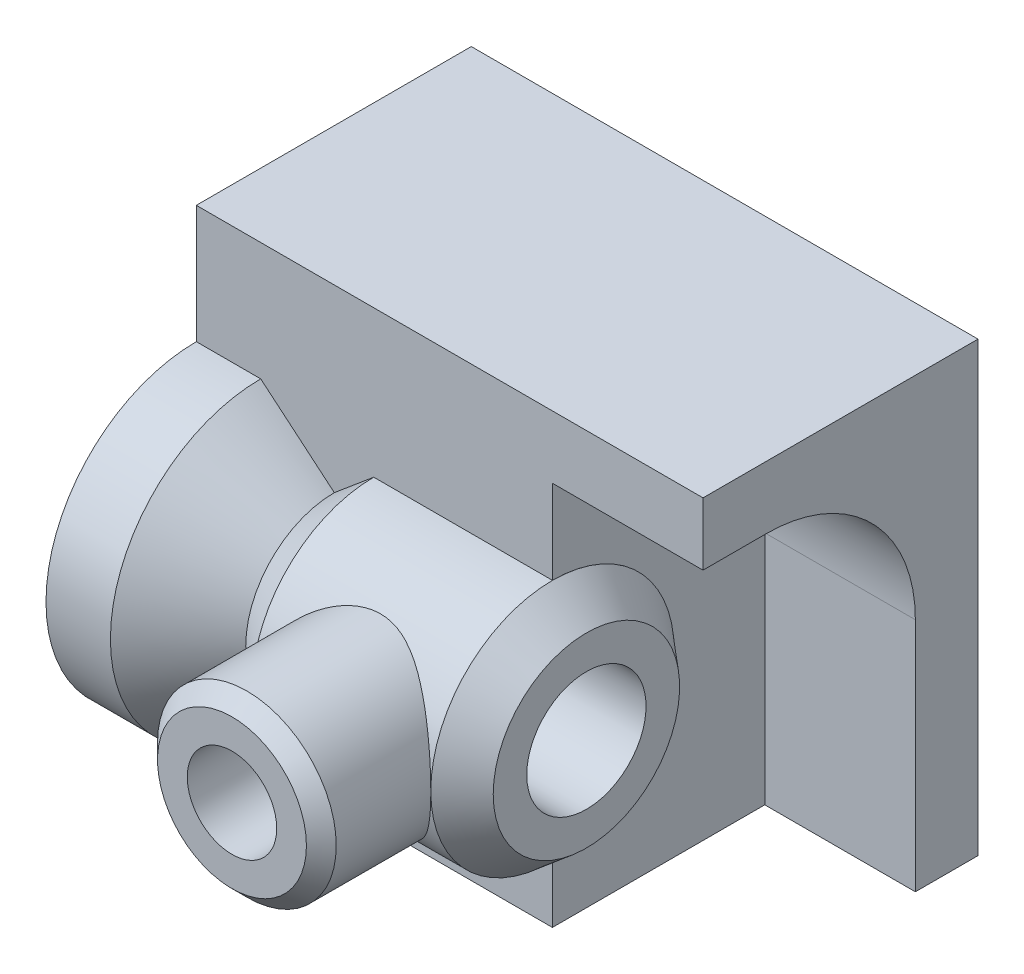
ISO-10303-21;
HEADER;
FILE_DESCRIPTION(('STEP AP214'),'2;1');
FILE_NAME('part.step','',(''),(''),'','','');
FILE_SCHEMA(('AUTOMOTIVE_DESIGN { 1 0 10303 214 1 1 1 1 }'));
ENDSEC;
DATA;
#1=APPLICATION_CONTEXT('core data for automotive mechanical design processes');
#2=APPLICATION_PROTOCOL_DEFINITION('international standard','automotive_design',2000,#1);
#3=PRODUCT_CONTEXT('',#1,'mechanical');
#4=PRODUCT('Part','Part','',(#3));
#5=PRODUCT_RELATED_PRODUCT_CATEGORY('part','',(#4));
#6=PRODUCT_DEFINITION_FORMATION('','',#4);
#7=PRODUCT_DEFINITION_CONTEXT('part definition',#1,'design');
#8=PRODUCT_DEFINITION('design','',#6,#7);
#9=PRODUCT_DEFINITION_SHAPE('','',#8);
#10=(LENGTH_UNIT() NAMED_UNIT(*) SI_UNIT(.MILLI.,.METRE.));
#11=(NAMED_UNIT(*) PLANE_ANGLE_UNIT() SI_UNIT($,.RADIAN.));
#12=(NAMED_UNIT(*) SI_UNIT($,.STERADIAN.) SOLID_ANGLE_UNIT());
#13=UNCERTAINTY_MEASURE_WITH_UNIT(LENGTH_MEASURE(1.E-05),#10,'distance_accuracy_value','');
#14=(GEOMETRIC_REPRESENTATION_CONTEXT(3) GLOBAL_UNCERTAINTY_ASSIGNED_CONTEXT((#13)) GLOBAL_UNIT_ASSIGNED_CONTEXT((#10,
#11,#12)) REPRESENTATION_CONTEXT('',''));
#15=CARTESIAN_POINT('',(0.,0.,0.));
#16=DIRECTION('',(0.,0.,1.));
#17=DIRECTION('',(1.,0.,0.));
#18=AXIS2_PLACEMENT_3D('',#15,#16,#17);
#19=CARTESIAN_POINT('',(11.94,0.,0.));
#20=DIRECTION('',(-1.,0.,0.));
#21=DIRECTION('',(0.,0.,1.));
#22=AXIS2_PLACEMENT_3D('',#19,#20,#21);
#23=PLANE('',#22);
#24=DIRECTION('',(0.,-1.,0.));
#25=VECTOR('',#24,1.);
#26=CARTESIAN_POINT('',(11.94,6.9,-7.12));
#27=LINE('',#26,#25);
#28=CARTESIAN_POINT('',(11.94,1.9,-7.12));
#29=VERTEX_POINT('',#28);
#30=CARTESIAN_POINT('',(11.94,-6.,-7.12));
#31=VERTEX_POINT('',#30);
#32=EDGE_CURVE('E166',#29,#31,#27,.T.);
#33=ORIENTED_EDGE('',*,*,#32,.F.);
#34=CARTESIAN_POINT('',(11.94,1.9,-2.12));
#35=DIRECTION('',(-1.,0.,0.));
#36=DIRECTION('',(0.,0.,1.));
#37=AXIS2_PLACEMENT_3D('',#34,#35,#36);
#38=CIRCLE('',#37,5.);
#39=CARTESIAN_POINT('',(11.94,6.9,-2.12));
#40=VERTEX_POINT('',#39);
#41=EDGE_CURVE('E70',#29,#40,#38,.F.);
#42=ORIENTED_EDGE('',*,*,#41,.T.);
#43=DIRECTION('',(0.,0.,-1.));
#44=VECTOR('',#43,1.);
#45=CARTESIAN_POINT('',(11.94,6.9,0.));
#46=LINE('',#45,#44);
#47=CARTESIAN_POINT('',(11.94,6.9,0.));
#48=VERTEX_POINT('',#47);
#49=EDGE_CURVE('E334',#48,#40,#46,.T.);
#50=ORIENTED_EDGE('',*,*,#49,.F.);
#51=DIRECTION('',(0.,1.,0.));
#52=VECTOR('',#51,1.);
#53=CARTESIAN_POINT('',(11.94,9.,0.));
#54=LINE('',#53,#52);
#55=CARTESIAN_POINT('',(11.94,4.08,0.));
#56=VERTEX_POINT('',#55);
#57=EDGE_CURVE('E171',#56,#48,#54,.T.);
#58=ORIENTED_EDGE('',*,*,#57,.F.);
#59=CARTESIAN_POINT('',(11.94,0.,0.));
#60=DIRECTION('',(-1.,0.,0.));
#61=DIRECTION('',(0.,0.,1.));
#62=AXIS2_PLACEMENT_3D('',#59,#60,#61);
#63=CIRCLE('',#62,4.08);
#64=CARTESIAN_POINT('',(11.94,-4.08,0.));
#65=VERTEX_POINT('',#64);
#66=EDGE_CURVE('E247',#56,#65,#63,.T.);
#67=ORIENTED_EDGE('',*,*,#66,.T.);
#68=CARTESIAN_POINT('',(11.94,-6.,0.));
#69=VERTEX_POINT('',#68);
#70=EDGE_CURVE('E189',#69,#65,#54,.T.);
#71=ORIENTED_EDGE('',*,*,#70,.F.);
#72=DIRECTION('',(0.,0.,1.));
#73=VECTOR('',#72,1.);
#74=CARTESIAN_POINT('',(11.94,-6.,-9.22));
#75=LINE('',#74,#73);
#76=EDGE_CURVE('E185',#31,#69,#75,.T.);
#77=ORIENTED_EDGE('',*,*,#76,.F.);
#78=EDGE_LOOP('',(#33,#42,#50,#58,#67,#71,#77));
#79=FACE_BOUND('',#78,.T.);
#80=ADVANCED_FACE('F39',(#79),#23,.F.);
#81=CARTESIAN_POINT('',(-0.16368545140619,0.,0.));
#82=DIRECTION('',(-1.,0.,0.));
#83=DIRECTION('',(0.,0.,1.));
#84=AXIS2_PLACEMENT_3D('',#81,#82,#83);
#85=CYLINDRICAL_SURFACE('',#84,2.);
#86=CARTESIAN_POINT('',(13.08,0.,0.));
#87=DIRECTION('',(-1.,0.,0.));
#88=DIRECTION('',(0.,0.,1.));
#89=AXIS2_PLACEMENT_3D('',#86,#87,#88);
#90=CIRCLE('',#89,2.);
#91=CARTESIAN_POINT('',(13.08,0.,2.));
#92=VERTEX_POINT('',#91);
#93=EDGE_CURVE('E376',#92,#92,#90,.T.);
#94=ORIENTED_EDGE('',*,*,#93,.F.);
#95=EDGE_LOOP('',(#94));
#96=FACE_BOUND('',#95,.T.);
#97=CARTESIAN_POINT('',(3.,0.,0.));
#98=DIRECTION('',(-1.,0.,0.));
#99=DIRECTION('',(0.,0.,1.));
#100=AXIS2_PLACEMENT_3D('',#97,#98,#99);
#101=CIRCLE('',#100,2.);
#102=CARTESIAN_POINT('',(3.,0.,2.));
#103=VERTEX_POINT('',#102);
#104=EDGE_CURVE('E380',#103,#103,#101,.T.);
#105=ORIENTED_EDGE('',*,*,#104,.T.);
#106=EDGE_LOOP('',(#105));
#107=FACE_BOUND('',#106,.T.);
#108=CARTESIAN_POINT('',(10.4458258717611,0.,2.));
#109=CARTESIAN_POINT('',(10.445821079749,-0.0732207358411543,1.99999540196395));
#110=CARTESIAN_POINT('',(10.4404208473866,-0.146561062021485,1.99593645526274));
#111=CARTESIAN_POINT('',(10.4191588083509,-0.290936396286467,1.98006607281083));
#112=CARTESIAN_POINT('',(10.403270700111,-0.361965136229004,1.96823514679854));
#113=CARTESIAN_POINT('',(10.3621129624773,-0.499234626631249,1.9379567495606));
#114=CARTESIAN_POINT('',(10.3369003581919,-0.565501615403737,1.91954951932009));
#115=CARTESIAN_POINT('',(10.2782835275738,-0.692422335520753,1.87750556721694));
#116=CARTESIAN_POINT('',(10.2448816975675,-0.753077701796332,1.85387037535483));
#117=CARTESIAN_POINT('',(10.1675628601702,-0.873465937590145,1.80049544543983));
#118=CARTESIAN_POINT('',(10.122958542427,-0.932593229272032,1.7703930854844));
#119=CARTESIAN_POINT('',(10.0263300343999,-1.04302716767671,1.70767017883378));
#120=CARTESIAN_POINT('',(9.97429438896122,-1.09432148272226,1.67504578078609));
#121=CARTESIAN_POINT('',(9.85224291848269,-1.19837161436623,1.6027112365199));
#122=CARTESIAN_POINT('',(9.78072219463935,-1.24930578421204,1.56290854864639));
#123=CARTESIAN_POINT('',(9.62837485939451,-1.33861998176348,1.48711444664135));
#124=CARTESIAN_POINT('',(9.54756117476075,-1.37701716983077,1.45111786883675));
#125=CARTESIAN_POINT('',(9.40632303308482,-1.42880627811788,1.39977155180178));
#126=CARTESIAN_POINT('',(9.34843517463268,-1.44625674456539,1.38157751186733));
#127=CARTESIAN_POINT('',(9.22943313697614,-1.47420672564844,1.35171594150685));
#128=CARTESIAN_POINT('',(9.16832669388627,-1.48472215355267,1.34003347910832));
#129=CARTESIAN_POINT('',(9.04364328623029,-1.49812822141445,1.32503759684553));
#130=CARTESIAN_POINT('',(8.980049065037,-1.50094954854207,1.32180026676597));
#131=CARTESIAN_POINT('',(8.85321096087948,-1.49848213241869,1.32459531776068));
#132=CARTESIAN_POINT('',(8.78996721167362,-1.49319048157349,1.33063102218113));
#133=CARTESIAN_POINT('',(8.67263452433527,-1.47597739291882,1.34967623262519));
#134=CARTESIAN_POINT('',(8.61828950071487,-1.46482486380817,1.36187157059871));
#135=CARTESIAN_POINT('',(8.51238699304018,-1.43705671120733,1.39114192844939));
#136=CARTESIAN_POINT('',(8.46083224393746,-1.42043583681172,1.40822163640769));
#137=CARTESIAN_POINT('',(8.32956948512691,-1.37033064172535,1.45741769294306));
#138=CARTESIAN_POINT('',(8.25242545511755,-1.3328014849398,1.49225649139232));
#139=CARTESIAN_POINT('',(8.10662934789198,-1.2461802331452,1.56533298145196));
#140=CARTESIAN_POINT('',(8.0379985325064,-1.19706004255879,1.60357878886109));
#141=CARTESIAN_POINT('',(7.90807248135741,-1.08651604102136,1.68051672313145));
#142=CARTESIAN_POINT('',(7.84700526487958,-1.02481375526037,1.71919586730239));
#143=CARTESIAN_POINT('',(7.7355622249799,-0.890422521709595,1.79248037980972));
#144=CARTESIAN_POINT('',(7.68516595153068,-0.817755054293762,1.8270934826376));
#145=CARTESIAN_POINT('',(7.60584507252073,-0.677902080454148,1.88279726073643));
#146=CARTESIAN_POINT('',(7.57464127754528,-0.612539870185625,1.90520770945008));
#147=CARTESIAN_POINT('',(7.52160099129719,-0.476352173202092,1.94372904416947));
#148=CARTESIAN_POINT('',(7.49975863326178,-0.405530141063772,1.95984387504351));
#149=CARTESIAN_POINT('',(7.46657250887462,-0.259676232483524,1.98445588635989));
#150=CARTESIAN_POINT('',(7.45529369282243,-0.184621281405948,1.99290592971749));
#151=CARTESIAN_POINT('',(7.44427627438935,-0.0332012397969222,2.00115883659445));
#152=CARTESIAN_POINT('',(7.44453280306569,0.0431632843727187,2.00096534845408));
#153=CARTESIAN_POINT('',(7.45593674103424,0.186804217329621,1.99242547175873));
#154=CARTESIAN_POINT('',(7.46598640864973,0.254222327546129,1.98490086600401));
#155=CARTESIAN_POINT('',(7.49479965176892,0.386110670609114,1.96351320201588));
#156=CARTESIAN_POINT('',(7.51356508145047,0.450580272987257,1.94964879507262));
#157=CARTESIAN_POINT('',(7.55971340235416,0.577416779689766,1.91599830683313));
#158=CARTESIAN_POINT('',(7.58737705318845,0.639629172536135,1.89602050290194));
#159=CARTESIAN_POINT('',(7.64999832718664,0.75851852704307,1.85166985411963));
#160=CARTESIAN_POINT('',(7.68495695940079,0.8151947213364,1.82729640132068));
#161=CARTESIAN_POINT('',(7.76760911817162,0.931511626319034,1.77119146886499));
#162=CARTESIAN_POINT('',(7.81645441119851,0.990066762698699,1.73891095025037));
#163=CARTESIAN_POINT('',(7.92183462434944,1.09871974855854,1.67238952874785));
#164=CARTESIAN_POINT('',(7.97838657145441,1.14879830469576,1.63814438507395));
#165=CARTESIAN_POINT('',(8.10997575272223,1.24877541075626,1.56369128291497));
#166=CARTESIAN_POINT('',(8.18648343325335,1.29683043648705,1.52358718520101));
#167=CARTESIAN_POINT('',(8.3491859497335,1.37923235998282,1.44940591348451));
#168=CARTESIAN_POINT('',(8.43535099366962,1.41362000515519,1.41531099570969));
#169=CARTESIAN_POINT('',(8.58124032063553,1.45615734256767,1.37118877808583));
#170=CARTESIAN_POINT('',(8.63821699816343,1.46931009512996,1.35695811824565));
#171=CARTESIAN_POINT('',(8.75453291874423,1.48891522181906,1.33542056103011));
#172=CARTESIAN_POINT('',(8.8138665785633,1.4953825519924,1.32809821220233));
#173=CARTESIAN_POINT('',(8.93365495157238,1.50115320209064,1.32157601792209));
#174=CARTESIAN_POINT('',(8.99411381477062,1.50042015325262,1.32241740684975));
#175=CARTESIAN_POINT('',(9.11388271051321,1.49176883838219,1.33216448543666));
#176=CARTESIAN_POINT('',(9.17319115965831,1.48384130024585,1.34108058157484));
#177=CARTESIAN_POINT('',(9.30174044317185,1.45893841819723,1.36817348797772));
#178=CARTESIAN_POINT('',(9.37032305189382,1.44036567954112,1.38794705950643));
#179=CARTESIAN_POINT('',(9.50236072059153,1.39469627266119,1.43382963385409));
#180=CARTESIAN_POINT('',(9.56580231379924,1.3675780729773,1.45995460146929));
#181=CARTESIAN_POINT('',(9.70834650224738,1.29498918933643,1.52516477328823));
#182=CARTESIAN_POINT('',(9.7852474545168,1.24641542065971,1.56560203191104));
#183=CARTESIAN_POINT('',(9.92895191673861,1.13650718465937,1.64713510181272));
#184=CARTESIAN_POINT('',(9.99574633770589,1.07516134758578,1.68823146954222));
#185=CARTESIAN_POINT('',(10.1186577140444,0.939627144937903,1.76728988939793));
#186=CARTESIAN_POINT('',(10.1746821911382,0.865337161562872,1.80522333711071));
#187=CARTESIAN_POINT('',(10.2730489229064,0.705159098936217,1.87357289668096));
#188=CARTESIAN_POINT('',(10.3154238463336,0.619299420401809,1.90400691592958));
#189=CARTESIAN_POINT('',(10.3736252927468,0.46484029035647,1.94636704624047));
#190=CARTESIAN_POINT('',(10.3935926031372,0.398553614774747,1.96110322499718));
#191=CARTESIAN_POINT('',(10.4242437743725,0.262841610392775,1.98383739970237));
#192=CARTESIAN_POINT('',(10.434953562011,0.193425623834921,1.99185421210894));
#193=CARTESIAN_POINT('',(10.4424305659754,0.102963309861902,1.99745471706309));
#194=CARTESIAN_POINT('',(10.4437021492505,0.0824069459941339,1.9984076143208));
#195=CARTESIAN_POINT('',(10.445400544992,0.0412368896243834,1.99968095423138));
#196=CARTESIAN_POINT('',(10.4458272214684,0.0206231884283906,2.00000129507253));
#197=CARTESIAN_POINT('',(10.4458258717611,0.,2.));
#198=B_SPLINE_CURVE_WITH_KNOTS('',3,(#108,#109,#110,#111,#112,#113,#114,#115,#116,#117,#118,
#119,#120,#121,#122,#123,#124,#125,#126,#127,#128,#129,#130,#131,#132,#133,#134,#135,#136,#137,
#138,#139,#140,#141,#142,#143,#144,#145,#146,#147,#148,#149,#150,#151,#152,#153,#154,#155,#156,
#157,#158,#159,#160,#161,#162,#163,#164,#165,#166,#167,#168,#169,#170,#171,#172,#173,#174,#175,
#176,#177,#178,#179,#180,#181,#182,#183,#184,#185,#186,#187,#188,#189,#190,#191,#192,#193,#194,
#195,#196,#197),.UNSPECIFIED.,.T.,.F.,(4,2,2,2,2,2,2,2,2,2,2,2,2,2,2,2,2,2,2,2,2,2,2,2,2,2,2,2,
2,2,2,2,2,2,2,2,2,2,2,2,2,2,2,2,4),(0.,0.219571786572042,0.439696319423244,0.658496333573381,
0.877232398849293,1.1162243131743,1.35558868405162,1.64360015887451,1.93121574056507,
2.11999518529901,2.3083399319529,2.49837587621257,2.6884799430021,2.85826890162709,
3.02822137600639,3.30449331805909,3.58144192357888,3.8653588393809,4.1487266249369,
4.37526505006389,4.60166129643117,4.82944058166898,5.05712372466613,5.26191187011994,
5.46674360185812,5.67880439483679,5.89089453977541,6.13840382081867,6.38646908985451,
6.68168596015946,6.97601595850112,7.15589161422932,7.33536399114208,7.5157433385474,
7.69635548563854,7.91639670960133,8.1369968513992,8.43412246655767,8.73151372390892,
9.03135449492648,9.33047220273162,9.54195697541629,9.75284752283255,9.8146816687871,
9.87652576630966),.UNSPECIFIED.);
#199=CARTESIAN_POINT('',(10.4458258717611,0.,2.));
#200=VERTEX_POINT('',#199);
#201=EDGE_CURVE('E44',#200,#200,#198,.T.);
#202=ORIENTED_EDGE('',*,*,#201,.F.);
#203=EDGE_LOOP('',(#202));
#204=FACE_BOUND('',#203,.T.);
#205=ADVANCED_FACE('F292',(#96,#107,#204),#85,.F.);
#206=CARTESIAN_POINT('',(-0.16368545140619,0.,0.));
#207=DIRECTION('',(-1.,0.,0.));
#208=DIRECTION('',(0.,0.,1.));
#209=AXIS2_PLACEMENT_3D('',#206,#207,#208);
#210=CYLINDRICAL_SURFACE('',#209,4.08);
#211=ORIENTED_EDGE('',*,*,#66,.F.);
#212=DIRECTION('',(-1.,0.,0.));
#213=VECTOR('',#212,1.);
#214=CARTESIAN_POINT('',(-0.16368545140619,4.08,0.));
#215=LINE('',#214,#213);
#216=CARTESIAN_POINT('',(5.94977642444958,4.08,0.));
#217=VERTEX_POINT('',#216);
#218=EDGE_CURVE('E243',#56,#217,#215,.T.);
#219=ORIENTED_EDGE('',*,*,#218,.T.);
#220=CARTESIAN_POINT('',(5.94977642444958,0.,0.));
#221=DIRECTION('',(-1.,0.,0.));
#222=DIRECTION('',(0.,0.,1.));
#223=AXIS2_PLACEMENT_3D('',#220,#221,#222);
#224=CIRCLE('',#223,4.08);
#225=CARTESIAN_POINT('',(5.94977642444958,0.,4.08));
#226=VERTEX_POINT('',#225);
#227=EDGE_CURVE('E360',#226,#217,#224,.T.);
#228=ORIENTED_EDGE('',*,*,#227,.F.);
#229=CARTESIAN_POINT('',(11.9418753190725,0.,4.08));
#230=CARTESIAN_POINT('',(11.9418746255293,0.0735491775092905,4.07999934370344));
#231=CARTESIAN_POINT('',(11.9391601986366,0.147117172830394,4.07800462354872));
#232=CARTESIAN_POINT('',(11.9283569013117,0.293657624512855,4.07008212111903));
#233=CARTESIAN_POINT('',(11.9202648620603,0.366629704044253,4.06415201987885));
#234=CARTESIAN_POINT('',(11.8880424889429,0.584028441169121,4.04060521606749));
#235=CARTESIAN_POINT('',(11.8559662829877,0.726763776326168,4.01723244972463));
#236=CARTESIAN_POINT('',(11.7728274093527,1.00252836167417,3.95742418455096));
#237=CARTESIAN_POINT('',(11.7218779859657,1.13560995371552,3.92106664355969));
#238=CARTESIAN_POINT('',(11.6033551784396,1.39054168583626,3.83806719325733));
#239=CARTESIAN_POINT('',(11.5357866194837,1.51239507181096,3.79142826943968));
#240=CARTESIAN_POINT('',(11.3793726788491,1.75406839076773,3.68626868372276));
#241=CARTESIAN_POINT('',(11.2891463915808,1.87268268398932,3.62705139921293));
#242=CARTESIAN_POINT('',(11.0935356154691,2.09416700324028,3.50384641045455));
#243=CARTESIAN_POINT('',(10.9881274198505,2.19701187666411,3.43985132230204));
#244=CARTESIAN_POINT('',(10.8088174116083,2.34803279003245,3.33733618298643));
#245=CARTESIAN_POINT('',(10.7392942779565,2.40156036825658,3.29892183982521));
#246=CARTESIAN_POINT('',(10.5954922823558,2.50252688642086,3.22300488522619));
#247=CARTESIAN_POINT('',(10.5212120512668,2.54996406157149,3.18550254059446));
#248=CARTESIAN_POINT('',(10.2915161009608,2.6826572457679,3.07616199464393));
#249=CARTESIAN_POINT('',(10.1289147879502,2.75857482115139,3.00729085433035));
#250=CARTESIAN_POINT('',(9.8436306534068,2.86093043407332,2.90942319761777));
#251=CARTESIAN_POINT('',(9.72575270023775,2.89542560324355,2.87479141123914));
#252=CARTESIAN_POINT('',(9.48374420314903,2.94996006160554,2.81880730976438));
#253=CARTESIAN_POINT('',(9.35962842622481,2.97003191668609,2.79742509406978));
#254=CARTESIAN_POINT('',(9.10703702268412,2.9944134743516,2.77132627519933));
#255=CARTESIAN_POINT('',(8.97853503062432,2.99859960795079,2.76674033340974));
#256=CARTESIAN_POINT('',(8.72263922491761,2.99047106473708,2.77551845305346));
#257=CARTESIAN_POINT('',(8.59524621548486,2.97814527830562,2.78889459982831));
#258=CARTESIAN_POINT('',(8.33226505766346,2.93589507444192,2.83335840833875));
#259=CARTESIAN_POINT('',(8.19726913149407,2.90422045450408,2.86619626341038));
#260=CARTESIAN_POINT('',(7.93633935176526,2.82417665422082,2.94509158471911));
#261=CARTESIAN_POINT('',(7.81042779130526,2.77576798724677,2.99118027471352));
#262=CARTESIAN_POINT('',(7.52615201203146,2.6444780153083,3.10859023968818));
#263=CARTESIAN_POINT('',(7.37194900325097,2.55546048813702,3.18308491453239));
#264=CARTESIAN_POINT('',(7.08259623635488,2.35285369217717,3.3356612883369));
#265=CARTESIAN_POINT('',(6.94746863928307,2.23923622601981,3.4137470219284));
#266=CARTESIAN_POINT('',(6.69613091725255,1.98679116840513,3.56667542334824));
#267=CARTESIAN_POINT('',(6.58021887638197,1.8476263713472,3.64145576393111));
#268=CARTESIAN_POINT('',(6.37346213794538,1.54673585558053,3.77904999058308));
#269=CARTESIAN_POINT('',(6.28256010526396,1.38506304066749,3.84189114289819));
#270=CARTESIAN_POINT('',(6.15018881204529,1.0863569046016,3.93498247158788));
#271=CARTESIAN_POINT('',(6.10202259060305,0.953601800294148,3.96945751059044));
#272=CARTESIAN_POINT('',(6.02452718219414,0.680059272086245,4.02533777035719));
#273=CARTESIAN_POINT('',(5.99518405390116,0.53927787720744,4.04675266353923));
#274=CARTESIAN_POINT('',(5.95696410457922,0.252900496827857,4.07470371198482));
#275=CARTESIAN_POINT('',(5.94816794624341,0.107287804327193,4.08118122525242));
#276=CARTESIAN_POINT('',(5.9518698839197,-0.183523466462492,4.07846264711362));
#277=CARTESIAN_POINT('',(5.96436805269668,-0.32872204333474,4.06926650214874));
#278=CARTESIAN_POINT('',(6.00842036698704,-0.605291212919964,4.03710704385833));
#279=CARTESIAN_POINT('',(6.03875944078061,-0.736963854433493,4.01502219692625));
#280=CARTESIAN_POINT('',(6.11590286405932,-0.992834211823623,3.95952472796475));
#281=CARTESIAN_POINT('',(6.16271066433868,-1.11703035471103,3.9261097319123));
#282=CARTESIAN_POINT('',(6.27518181968447,-1.36528066081615,3.84716698523618));
#283=CARTESIAN_POINT('',(6.34204216901356,-1.48854930475332,3.8008911485081));
#284=CARTESIAN_POINT('',(6.49049587008036,-1.72246575614312,3.70077415414543));
#285=CARTESIAN_POINT('',(6.57209820922258,-1.83310579709264,3.64692838599407));
#286=CARTESIAN_POINT('',(6.76440773410127,-2.06003234814774,3.52451065146939));
#287=CARTESIAN_POINT('',(6.87770815776099,-2.17363940754857,3.45504810994084));
#288=CARTESIAN_POINT('',(7.12070849729213,-2.38135452932775,3.31530123309393));
#289=CARTESIAN_POINT('',(7.250423757459,-2.47544412708751,3.24501618543326));
#290=CARTESIAN_POINT('',(7.51194003933156,-2.63464908888821,3.11679635521239));
#291=CARTESIAN_POINT('',(7.6422958895957,-2.70169836510446,3.05832600632089));
#292=CARTESIAN_POINT('',(7.91518029363006,-2.81707631511567,2.95239158775341));
#293=CARTESIAN_POINT('',(8.0576828159428,-2.8654438526854,2.90490475250362));
#294=CARTESIAN_POINT('',(8.31877476998334,-2.9320296296191,2.83748505928712));
#295=CARTESIAN_POINT('',(8.43522624206179,-2.9546420356318,2.81371356054709));
#296=CARTESIAN_POINT('',(8.67193772353184,-2.98588220326539,2.78054882930827));
#297=CARTESIAN_POINT('',(8.79219150776876,-2.99453172737004,2.77113322305526));
#298=CARTESIAN_POINT('',(9.03335716969437,-2.99720254662996,2.76824584055418));
#299=CARTESIAN_POINT('',(9.15426993551904,-2.99118842844831,2.77481266249973));
#300=CARTESIAN_POINT('',(9.3928272307319,-2.96495466781955,2.80281760012797));
#301=CARTESIAN_POINT('',(9.51046706258697,-2.94471560226142,2.82427604871654));
#302=CARTESIAN_POINT('',(9.77240239302873,-2.88373916560956,2.88666237959238));
#303=CARTESIAN_POINT('',(9.91479458174369,-2.83881601029515,2.93138613248897));
#304=CARTESIAN_POINT('',(10.1879343818935,-2.73041977179836,3.03260688843912));
#305=CARTESIAN_POINT('',(10.3186502086816,-2.66689795523717,3.0891347082059));
#306=CARTESIAN_POINT('',(10.6021338310732,-2.50332271355381,3.22395215696351));
#307=CARTESIAN_POINT('',(10.7510655473563,-2.3980264601012,3.30394855934907));
#308=CARTESIAN_POINT('',(11.027779632599,-2.16212445847226,3.46292838403462));
#309=CARTESIAN_POINT('',(11.1555736796325,-2.03153277260952,3.54191234328373));
#310=CARTESIAN_POINT('',(11.3692176247795,-1.76847995650271,3.67931491263199));
#311=CARTESIAN_POINT('',(11.4585007654574,-1.63948753817898,3.73901965928155));
#312=CARTESIAN_POINT('',(11.6172297524853,-1.36560423865754,3.84748306497215));
#313=CARTESIAN_POINT('',(11.6866962929687,-1.22073016295094,3.89625313143086));
#314=CARTESIAN_POINT('',(11.7936669694421,-0.940783829850461,3.97229217643159));
#315=CARTESIAN_POINT('',(11.8344120253634,-0.807530152479541,4.00169489006318));
#316=CARTESIAN_POINT('',(11.8970887683045,-0.534637030024803,4.04716762757649));
#317=CARTESIAN_POINT('',(11.9190684233969,-0.395014833485447,4.06327164208493));
#318=CARTESIAN_POINT('',(11.9346648659253,-0.212052449793226,4.07470797167595));
#319=CARTESIAN_POINT('',(11.9373658521055,-0.169720568147044,4.07668967302653));
#320=CARTESIAN_POINT('',(11.9409713953748,-0.0849278928753425,4.07933596205495));
#321=CARTESIAN_POINT('',(11.9418757195224,-0.0424670832486664,4.08000037894374));
#322=CARTESIAN_POINT('',(11.9418753190725,0.,4.08));
#323=B_SPLINE_CURVE_WITH_KNOTS('',3,(#229,#230,#231,#232,#233,#234,#235,#236,#237,#238,#239,
#240,#241,#242,#243,#244,#245,#246,#247,#248,#249,#250,#251,#252,#253,#254,#255,#256,#257,#258,
#259,#260,#261,#262,#263,#264,#265,#266,#267,#268,#269,#270,#271,#272,#273,#274,#275,#276,#277,
#278,#279,#280,#281,#282,#283,#284,#285,#286,#287,#288,#289,#290,#291,#292,#293,#294,#295,#296,
#297,#298,#299,#300,#301,#302,#303,#304,#305,#306,#307,#308,#309,#310,#311,#312,#313,#314,#315,
#316,#317,#318,#319,#320,#321,#322),.UNSPECIFIED.,.T.,.F.,(4,2,2,2,2,2,2,2,2,2,2,2,2,2,2,2,2,2,
2,2,2,2,2,2,2,2,2,2,2,2,2,2,2,2,2,2,2,2,2,2,2,2,2,2,2,2,4),(0.,0.220595577062654,
0.441321257976244,0.883286509730171,1.32264171086547,1.76186950031609,2.24127565253485,
2.72143868813517,3.00848730325254,3.29561890836615,3.86846769204417,4.24999755340358,
4.63066324192637,5.01428398566845,5.3981629683893,5.82332921804758,6.24950564133932,
6.82557169372779,7.40230158362532,7.98727698935941,8.5708999556244,9.0052104757723,
9.43919895124136,9.87488832330769,10.3105791841719,10.7195627009969,11.1286319657571,
11.5700010323466,12.0116400917606,12.5341944670786,13.0572409760271,13.529124426928,
14.0000208585275,14.3614939244186,14.7224030541882,15.0841846582344,15.4464612103355,
15.9114903100019,16.3777489825524,16.9723688736843,17.5666591457632,18.0682540916264,
18.5693232968338,18.994799266484,19.4191843510437,19.5465390910889,19.6739103418989),.UNSPECIFIED.);
#324=CARTESIAN_POINT('',(11.9418753190725,0.,4.08));
#325=VERTEX_POINT('',#324);
#326=EDGE_CURVE('E259',#325,#226,#323,.T.);
#327=ORIENTED_EDGE('',*,*,#326,.F.);
#328=CARTESIAN_POINT('',(11.9418753190725,0.,0.));
#329=DIRECTION('',(-1.,0.,0.));
#330=DIRECTION('',(0.,0.,1.));
#331=AXIS2_PLACEMENT_3D('',#328,#329,#330);
#332=CIRCLE('',#331,4.08);
#333=EDGE_CURVE('E365',#325,#325,#332,.T.);
#334=ORIENTED_EDGE('',*,*,#333,.T.);
#335=EDGE_CURVE('E250',#226,#325,#323,.T.);
#336=ORIENTED_EDGE('',*,*,#335,.F.);
#337=CARTESIAN_POINT('',(5.94977642444958,-4.08,0.));
#338=VERTEX_POINT('',#337);
#339=EDGE_CURVE('E355',#338,#226,#224,.T.);
#340=ORIENTED_EDGE('',*,*,#339,.F.);
#341=DIRECTION('',(-1.,0.,0.));
#342=VECTOR('',#341,1.);
#343=CARTESIAN_POINT('',(-0.16368545140619,-4.08,0.));
#344=LINE('',#343,#342);
#345=EDGE_CURVE('E227',#338,#65,#344,.F.);
#346=ORIENTED_EDGE('',*,*,#345,.T.);
#347=EDGE_LOOP('',(#211,#219,#228,#327,#334,#336,#340,#346));
#348=FACE_BOUND('',#347,.T.);
#349=ADVANCED_FACE('F262',(#348),#210,.T.);
#350=CARTESIAN_POINT('',(0.,5.04,0.));
#351=DIRECTION('',(1.,0.,0.));
#352=DIRECTION('',(0.,0.,-1.));
#353=AXIS2_PLACEMENT_3D('',#350,#351,#352);
#354=PLANE('',#353);
#355=CARTESIAN_POINT('',(0.,0.,0.));
#356=DIRECTION('',(-1.,0.,0.));
#357=DIRECTION('',(0.,0.,1.));
#358=AXIS2_PLACEMENT_3D('',#355,#356,#357);
#359=CIRCLE('',#358,3.65);
#360=CARTESIAN_POINT('',(0.,0.,3.65));
#361=VERTEX_POINT('',#360);
#362=EDGE_CURVE('E388',#361,#361,#359,.T.);
#363=ORIENTED_EDGE('',*,*,#362,.F.);
#364=EDGE_LOOP('',(#363));
#365=FACE_BOUND('',#364,.T.);
#366=CARTESIAN_POINT('',(0.,0.,0.));
#367=DIRECTION('',(-1.,0.,0.));
#368=DIRECTION('',(0.,0.,1.));
#369=AXIS2_PLACEMENT_3D('',#366,#367,#368);
#370=CIRCLE('',#369,5.04);
#371=CARTESIAN_POINT('',(0.,-5.04,0.));
#372=VERTEX_POINT('',#371);
#373=CARTESIAN_POINT('',(0.,5.04,0.));
#374=VERTEX_POINT('',#373);
#375=EDGE_CURVE('E260',#372,#374,#370,.T.);
#376=ORIENTED_EDGE('',*,*,#375,.T.);
#377=DIRECTION('',(0.,1.,0.));
#378=VECTOR('',#377,1.);
#379=CARTESIAN_POINT('',(0.,9.,0.));
#380=LINE('',#379,#378);
#381=CARTESIAN_POINT('',(0.,9.,0.));
#382=VERTEX_POINT('',#381);
#383=EDGE_CURVE('E197',#374,#382,#380,.T.);
#384=ORIENTED_EDGE('',*,*,#383,.T.);
#385=DIRECTION('',(0.,0.,-1.));
#386=VECTOR('',#385,1.);
#387=CARTESIAN_POINT('',(0.,9.,-9.22));
#388=LINE('',#387,#386);
#389=CARTESIAN_POINT('',(0.,9.,-9.22));
#390=VERTEX_POINT('',#389);
#391=EDGE_CURVE('E188',#382,#390,#388,.T.);
#392=ORIENTED_EDGE('',*,*,#391,.T.);
#393=DIRECTION('',(0.,-1.,0.));
#394=VECTOR('',#393,1.);
#395=CARTESIAN_POINT('',(0.,9.,-9.22));
#396=LINE('',#395,#394);
#397=CARTESIAN_POINT('',(0.,-6.,-9.22));
#398=VERTEX_POINT('',#397);
#399=EDGE_CURVE('E173',#390,#398,#396,.T.);
#400=ORIENTED_EDGE('',*,*,#399,.T.);
#401=DIRECTION('',(0.,0.,1.));
#402=VECTOR('',#401,1.);
#403=CARTESIAN_POINT('',(0.,-6.,-9.22));
#404=LINE('',#403,#402);
#405=CARTESIAN_POINT('',(0.,-6.,0.));
#406=VERTEX_POINT('',#405);
#407=EDGE_CURVE('E179',#398,#406,#404,.T.);
#408=ORIENTED_EDGE('',*,*,#407,.T.);
#409=EDGE_CURVE('E198',#406,#372,#380,.T.);
#410=ORIENTED_EDGE('',*,*,#409,.T.);
#411=EDGE_LOOP('',(#376,#384,#392,#400,#408,#410));
#412=FACE_BOUND('',#411,.T.);
#413=ADVANCED_FACE('F325',(#365,#412),#354,.F.);
#414=CARTESIAN_POINT('',(-0.16368545140619,0.,0.));
#415=DIRECTION('',(-1.,0.,0.));
#416=DIRECTION('',(0.,0.,1.));
#417=AXIS2_PLACEMENT_3D('',#414,#415,#416);
#418=CYLINDRICAL_SURFACE('',#417,3.65);
#419=ORIENTED_EDGE('',*,*,#362,.T.);
#420=EDGE_LOOP('',(#419));
#421=FACE_BOUND('',#420,.T.);
#422=CARTESIAN_POINT('',(3.,0.,0.));
#423=DIRECTION('',(-1.,0.,0.));
#424=DIRECTION('',(0.,0.,1.));
#425=AXIS2_PLACEMENT_3D('',#422,#423,#424);
#426=CIRCLE('',#425,3.65);
#427=CARTESIAN_POINT('',(3.,0.,3.65));
#428=VERTEX_POINT('',#427);
#429=EDGE_CURVE('E384',#428,#428,#426,.T.);
#430=ORIENTED_EDGE('',*,*,#429,.F.);
#431=EDGE_LOOP('',(#430));
#432=FACE_BOUND('',#431,.T.);
#433=ADVANCED_FACE('F534',(#421,#432),#418,.F.);
#434=CARTESIAN_POINT('',(3.,3.65,0.));
#435=DIRECTION('',(1.,0.,0.));
#436=DIRECTION('',(0.,0.,-1.));
#437=AXIS2_PLACEMENT_3D('',#434,#435,#436);
#438=PLANE('',#437);
#439=ORIENTED_EDGE('',*,*,#429,.T.);
#440=EDGE_LOOP('',(#439));
#441=FACE_BOUND('',#440,.T.);
#442=ORIENTED_EDGE('',*,*,#104,.F.);
#443=EDGE_LOOP('',(#442));
#444=FACE_BOUND('',#443,.T.);
#445=ADVANCED_FACE('F541',(#441,#444),#438,.F.);
#446=CARTESIAN_POINT('',(13.08,2.,0.));
#447=DIRECTION('',(-1.,0.,0.));
#448=DIRECTION('',(0.,0.,1.));
#449=AXIS2_PLACEMENT_3D('',#446,#447,#448);
#450=PLANE('',#449);
#451=CARTESIAN_POINT('',(13.08,0.,0.));
#452=DIRECTION('',(-1.,0.,0.));
#453=DIRECTION('',(0.,0.,1.));
#454=AXIS2_PLACEMENT_3D('',#451,#452,#453);
#455=CIRCLE('',#454,3.125);
#456=CARTESIAN_POINT('',(13.08,0.,3.125));
#457=VERTEX_POINT('',#456);
#458=EDGE_CURVE('E372',#457,#457,#455,.T.);
#459=ORIENTED_EDGE('',*,*,#458,.F.);
#460=EDGE_LOOP('',(#459));
#461=FACE_BOUND('',#460,.T.);
#462=ORIENTED_EDGE('',*,*,#93,.T.);
#463=EDGE_LOOP('',(#462));
#464=FACE_BOUND('',#463,.T.);
#465=ADVANCED_FACE('F288',(#461,#464),#450,.F.);
#466=CARTESIAN_POINT('',(13.08,0.,0.));
#467=DIRECTION('',(-1.,0.,0.));
#468=DIRECTION('',(0.,0.,1.));
#469=AXIS2_PLACEMENT_3D('',#466,#467,#468);
#470=CONICAL_SURFACE('',#469,3.125,0.698131700797733);
#471=ORIENTED_EDGE('',*,*,#333,.F.);
#472=EDGE_LOOP('',(#471));
#473=FACE_BOUND('',#472,.T.);
#474=ORIENTED_EDGE('',*,*,#458,.T.);
#475=EDGE_LOOP('',(#474));
#476=FACE_BOUND('',#475,.T.);
#477=ADVANCED_FACE('F283',(#473,#476),#470,.T.);
#478=CARTESIAN_POINT('',(5.94977642444958,0.,0.));
#479=DIRECTION('',(1.,0.,0.));
#480=DIRECTION('',(0.,0.,-1.));
#481=AXIS2_PLACEMENT_3D('',#478,#479,#480);
#482=CONICAL_SURFACE('',#481,4.08,0.698131700797732);
#483=CARTESIAN_POINT('',(4.62692993667001,0.,0.));
#484=DIRECTION('',(-1.,0.,0.));
#485=DIRECTION('',(0.,0.,1.));
#486=AXIS2_PLACEMENT_3D('',#483,#484,#485);
#487=CIRCLE('',#486,2.97);
#488=CARTESIAN_POINT('',(4.62692993667001,-2.97,0.));
#489=VERTEX_POINT('',#488);
#490=CARTESIAN_POINT('',(4.62692993667001,2.97,0.));
#491=VERTEX_POINT('',#490);
#492=EDGE_CURVE('E361',#489,#491,#487,.T.);
#493=ORIENTED_EDGE('',*,*,#492,.F.);
#494=DIRECTION('',(0.766044443118978,-0.64278760968654,0.));
#495=VECTOR('',#494,1.);
#496=CARTESIAN_POINT('',(1.08742176666521,0.,0.));
#497=LINE('',#496,#495);
#498=EDGE_CURVE('E223',#489,#338,#497,.T.);
#499=ORIENTED_EDGE('',*,*,#498,.T.);
#500=ORIENTED_EDGE('',*,*,#339,.T.);
#501=ORIENTED_EDGE('',*,*,#227,.T.);
#502=DIRECTION('',(-0.766044443118978,-0.64278760968654,0.));
#503=VECTOR('',#502,1.);
#504=CARTESIAN_POINT('',(1.08742176666521,0.,0.));
#505=LINE('',#504,#503);
#506=EDGE_CURVE('E239',#217,#491,#505,.T.);
#507=ORIENTED_EDGE('',*,*,#506,.T.);
#508=EDGE_LOOP('',(#493,#499,#500,#501,#507));
#509=FACE_BOUND('',#508,.T.);
#510=ADVANCED_FACE('F280',(#509),#482,.T.);
#511=CARTESIAN_POINT('',(4.62692993667001,0.,0.));
#512=DIRECTION('',(-1.,0.,0.));
#513=DIRECTION('',(0.,0.,1.));
#514=AXIS2_PLACEMENT_3D('',#511,#512,#513);
#515=CONICAL_SURFACE('',#514,2.97,0.698131700797733);
#516=ORIENTED_EDGE('',*,*,#492,.T.);
#517=DIRECTION('',(-0.766044443118977,0.64278760968654,0.));
#518=VECTOR('',#517,1.);
#519=CARTESIAN_POINT('',(8.1664381066748,0.,0.));
#520=LINE('',#519,#518);
#521=CARTESIAN_POINT('',(2.16,5.04,0.));
#522=VERTEX_POINT('',#521);
#523=EDGE_CURVE('E235',#491,#522,#520,.T.);
#524=ORIENTED_EDGE('',*,*,#523,.T.);
#525=CARTESIAN_POINT('',(2.16,0.,0.));
#526=DIRECTION('',(-1.,0.,0.));
#527=DIRECTION('',(0.,0.,1.));
#528=AXIS2_PLACEMENT_3D('',#525,#526,#527);
#529=CIRCLE('',#528,5.04);
#530=CARTESIAN_POINT('',(2.16,-5.04,0.));
#531=VERTEX_POINT('',#530);
#532=EDGE_CURVE('E367',#531,#522,#529,.T.);
#533=ORIENTED_EDGE('',*,*,#532,.F.);
#534=DIRECTION('',(0.766044443118977,0.64278760968654,0.));
#535=VECTOR('',#534,1.);
#536=CARTESIAN_POINT('',(8.1664381066748,0.,0.));
#537=LINE('',#536,#535);
#538=EDGE_CURVE('E219',#531,#489,#537,.T.);
#539=ORIENTED_EDGE('',*,*,#538,.T.);
#540=EDGE_LOOP('',(#516,#524,#533,#539));
#541=FACE_BOUND('',#540,.T.);
#542=ADVANCED_FACE('F277',(#541),#515,.T.);
#543=CARTESIAN_POINT('',(-0.16368545140619,0.,0.));
#544=DIRECTION('',(-1.,0.,0.));
#545=DIRECTION('',(0.,0.,1.));
#546=AXIS2_PLACEMENT_3D('',#543,#544,#545);
#547=CYLINDRICAL_SURFACE('',#546,5.04);
#548=ORIENTED_EDGE('',*,*,#532,.T.);
#549=DIRECTION('',(-1.,0.,0.));
#550=VECTOR('',#549,1.);
#551=CARTESIAN_POINT('',(-0.16368545140619,5.04,0.));
#552=LINE('',#551,#550);
#553=EDGE_CURVE('E231',#522,#374,#552,.T.);
#554=ORIENTED_EDGE('',*,*,#553,.T.);
#555=ORIENTED_EDGE('',*,*,#375,.F.);
#556=DIRECTION('',(-1.,0.,0.));
#557=VECTOR('',#556,1.);
#558=CARTESIAN_POINT('',(-0.16368545140619,-5.04,0.));
#559=LINE('',#558,#557);
#560=EDGE_CURVE('E207',#372,#531,#559,.F.);
#561=ORIENTED_EDGE('',*,*,#560,.T.);
#562=EDGE_LOOP('',(#548,#554,#555,#561));
#563=FACE_BOUND('',#562,.T.);
#564=ADVANCED_FACE('F274',(#563),#547,.T.);
#565=CARTESIAN_POINT('',(8.94582587176106,0.,7.75));
#566=DIRECTION('',(0.,0.,1.));
#567=DIRECTION('',(1.,0.,0.));
#568=AXIS2_PLACEMENT_3D('',#565,#566,#567);
#569=PLANE('',#568);
#570=CARTESIAN_POINT('',(8.94582587176106,0.,7.75));
#571=DIRECTION('',(0.,0.,1.));
#572=DIRECTION('',(1.,0.,0.));
#573=AXIS2_PLACEMENT_3D('',#570,#571,#572);
#574=CIRCLE('',#573,1.5);
#575=CARTESIAN_POINT('',(10.4458258717611,0.,7.75));
#576=VERTEX_POINT('',#575);
#577=EDGE_CURVE('E336',#576,#576,#574,.T.);
#578=ORIENTED_EDGE('',*,*,#577,.F.);
#579=EDGE_LOOP('',(#578));
#580=FACE_BOUND('',#579,.T.);
#581=CARTESIAN_POINT('',(8.94582587176106,0.,7.75));
#582=DIRECTION('',(0.,0.,1.));
#583=DIRECTION('',(1.,0.,0.));
#584=AXIS2_PLACEMENT_3D('',#581,#582,#583);
#585=CIRCLE('',#584,2.49604944731148);
#586=CARTESIAN_POINT('',(11.4418753190725,0.,7.75));
#587=VERTEX_POINT('',#586);
#588=EDGE_CURVE('E55',#587,#587,#585,.T.);
#589=ORIENTED_EDGE('',*,*,#588,.T.);
#590=EDGE_LOOP('',(#589));
#591=FACE_BOUND('',#590,.T.);
#592=ADVANCED_FACE('F271',(#580,#591),#569,.T.);
#593=CARTESIAN_POINT('',(8.94582587176106,0.,7.75));
#594=DIRECTION('',(0.,0.,-1.));
#595=DIRECTION('',(-1.,0.,0.));
#596=AXIS2_PLACEMENT_3D('',#593,#594,#595);
#597=CYLINDRICAL_SURFACE('',#596,2.99604944731148);
#598=CARTESIAN_POINT('',(8.94582587176106,0.,7.25));
#599=DIRECTION('',(0.,0.,1.));
#600=DIRECTION('',(1.,0.,0.));
#601=AXIS2_PLACEMENT_3D('',#598,#599,#600);
#602=CIRCLE('',#601,2.99604944731148);
#603=CARTESIAN_POINT('',(11.9418753190725,0.,7.25));
#604=VERTEX_POINT('',#603);
#605=EDGE_CURVE('E11',#604,#604,#602,.F.);
#606=ORIENTED_EDGE('',*,*,#605,.T.);
#607=EDGE_LOOP('',(#606));
#608=FACE_BOUND('',#607,.T.);
#609=ORIENTED_EDGE('',*,*,#335,.T.);
#610=ORIENTED_EDGE('',*,*,#326,.T.);
#611=EDGE_LOOP('',(#609,#610));
#612=FACE_BOUND('',#611,.T.);
#613=ADVANCED_FACE('F266',(#608,#612),#597,.T.);
#614=CARTESIAN_POINT('',(11.94,9.,0.));
#615=DIRECTION('',(0.,0.,1.));
#616=DIRECTION('',(0.,-1.,0.));
#617=AXIS2_PLACEMENT_3D('',#614,#615,#616);
#618=PLANE('',#617);
#619=ORIENTED_EDGE('',*,*,#218,.F.);
#620=ORIENTED_EDGE('',*,*,#57,.T.);
#621=DIRECTION('',(-1.,0.,0.));
#622=VECTOR('',#621,1.);
#623=CARTESIAN_POINT('',(16.99,6.9,0.));
#624=LINE('',#623,#622);
#625=CARTESIAN_POINT('',(16.99,6.9,0.));
#626=VERTEX_POINT('',#625);
#627=EDGE_CURVE('E150',#626,#48,#624,.T.);
#628=ORIENTED_EDGE('',*,*,#627,.F.);
#629=DIRECTION('',(0.,-1.,0.));
#630=VECTOR('',#629,1.);
#631=CARTESIAN_POINT('',(16.99,9.,0.));
#632=LINE('',#631,#630);
#633=CARTESIAN_POINT('',(16.99,9.,0.));
#634=VERTEX_POINT('',#633);
#635=EDGE_CURVE('E155',#634,#626,#632,.T.);
#636=ORIENTED_EDGE('',*,*,#635,.F.);
#637=DIRECTION('',(-1.,0.,0.));
#638=VECTOR('',#637,1.);
#639=CARTESIAN_POINT('',(11.94,9.,0.));
#640=LINE('',#639,#638);
#641=EDGE_CURVE('E208',#634,#382,#640,.T.);
#642=ORIENTED_EDGE('',*,*,#641,.T.);
#643=ORIENTED_EDGE('',*,*,#383,.F.);
#644=ORIENTED_EDGE('',*,*,#553,.F.);
#645=ORIENTED_EDGE('',*,*,#523,.F.);
#646=ORIENTED_EDGE('',*,*,#506,.F.);
#647=EDGE_LOOP('',(#619,#620,#628,#636,#642,#643,#644,#645,#646));
#648=FACE_BOUND('',#647,.T.);
#649=ADVANCED_FACE('F169',(#648),#618,.T.);
#650=CARTESIAN_POINT('',(11.94,9.,-9.22));
#651=DIRECTION('',(0.,0.,-1.));
#652=DIRECTION('',(0.,1.,0.));
#653=AXIS2_PLACEMENT_3D('',#650,#651,#652);
#654=PLANE('',#653);
#655=ORIENTED_EDGE('',*,*,#399,.F.);
#656=DIRECTION('',(-1.,0.,0.));
#657=VECTOR('',#656,1.);
#658=CARTESIAN_POINT('',(11.94,9.,-9.22));
#659=LINE('',#658,#657);
#660=CARTESIAN_POINT('',(16.99,9.,-9.22));
#661=VERTEX_POINT('',#660);
#662=EDGE_CURVE('E204',#661,#390,#659,.T.);
#663=ORIENTED_EDGE('',*,*,#662,.F.);
#664=DIRECTION('',(0.,1.,0.));
#665=VECTOR('',#664,1.);
#666=CARTESIAN_POINT('',(16.99,9.,-9.22));
#667=LINE('',#666,#665);
#668=CARTESIAN_POINT('',(16.99,-6.,-9.22));
#669=VERTEX_POINT('',#668);
#670=EDGE_CURVE('E327',#669,#661,#667,.T.);
#671=ORIENTED_EDGE('',*,*,#670,.F.);
#672=DIRECTION('',(-1.,0.,0.));
#673=VECTOR('',#672,1.);
#674=CARTESIAN_POINT('',(11.94,-6.,-9.22));
#675=LINE('',#674,#673);
#676=EDGE_CURVE('E192',#669,#398,#675,.T.);
#677=ORIENTED_EDGE('',*,*,#676,.T.);
#678=EDGE_LOOP('',(#655,#663,#671,#677));
#679=FACE_BOUND('',#678,.T.);
#680=ADVANCED_FACE('F306',(#679),#654,.T.);
#681=CARTESIAN_POINT('',(11.94,9.,-9.22));
#682=DIRECTION('',(0.,1.,0.));
#683=DIRECTION('',(0.,0.,1.));
#684=AXIS2_PLACEMENT_3D('',#681,#682,#683);
#685=PLANE('',#684);
#686=ORIENTED_EDGE('',*,*,#391,.F.);
#687=ORIENTED_EDGE('',*,*,#641,.F.);
#688=DIRECTION('',(0.,0.,1.));
#689=VECTOR('',#688,1.);
#690=CARTESIAN_POINT('',(16.99,9.,0.));
#691=LINE('',#690,#689);
#692=EDGE_CURVE('E162',#661,#634,#691,.T.);
#693=ORIENTED_EDGE('',*,*,#692,.F.);
#694=ORIENTED_EDGE('',*,*,#662,.T.);
#695=EDGE_LOOP('',(#686,#687,#693,#694));
#696=FACE_BOUND('',#695,.T.);
#697=ADVANCED_FACE('F302',(#696),#685,.T.);
#698=ORIENTED_EDGE('',*,*,#345,.F.);
#699=ORIENTED_EDGE('',*,*,#498,.F.);
#700=ORIENTED_EDGE('',*,*,#538,.F.);
#701=ORIENTED_EDGE('',*,*,#560,.F.);
#702=ORIENTED_EDGE('',*,*,#409,.F.);
#703=DIRECTION('',(-1.,0.,0.));
#704=VECTOR('',#703,1.);
#705=CARTESIAN_POINT('',(11.94,-6.,0.));
#706=LINE('',#705,#704);
#707=EDGE_CURVE('E211',#69,#406,#706,.T.);
#708=ORIENTED_EDGE('',*,*,#707,.F.);
#709=ORIENTED_EDGE('',*,*,#70,.T.);
#710=EDGE_LOOP('',(#698,#699,#700,#701,#702,#708,#709));
#711=FACE_BOUND('',#710,.T.);
#712=ADVANCED_FACE('F305',(#711),#618,.T.);
#713=CARTESIAN_POINT('',(11.94,-6.,-9.22));
#714=DIRECTION('',(0.,-1.,0.));
#715=DIRECTION('',(0.,0.,-1.));
#716=AXIS2_PLACEMENT_3D('',#713,#714,#715);
#717=PLANE('',#716);
#718=ORIENTED_EDGE('',*,*,#407,.F.);
#719=ORIENTED_EDGE('',*,*,#676,.F.);
#720=DIRECTION('',(0.,0.,-1.));
#721=VECTOR('',#720,1.);
#722=CARTESIAN_POINT('',(16.99,-6.,-7.12));
#723=LINE('',#722,#721);
#724=CARTESIAN_POINT('',(16.99,-6.,-7.12));
#725=VERTEX_POINT('',#724);
#726=EDGE_CURVE('E330',#725,#669,#723,.T.);
#727=ORIENTED_EDGE('',*,*,#726,.F.);
#728=DIRECTION('',(-1.,0.,0.));
#729=VECTOR('',#728,1.);
#730=CARTESIAN_POINT('',(16.99,-6.,-7.12));
#731=LINE('',#730,#729);
#732=EDGE_CURVE('E174',#725,#31,#731,.T.);
#733=ORIENTED_EDGE('',*,*,#732,.T.);
#734=ORIENTED_EDGE('',*,*,#76,.T.);
#735=ORIENTED_EDGE('',*,*,#707,.T.);
#736=EDGE_LOOP('',(#718,#719,#727,#733,#734,#735));
#737=FACE_BOUND('',#736,.T.);
#738=ADVANCED_FACE('F310',(#737),#717,.T.);
#739=CARTESIAN_POINT('',(16.99,6.9,0.));
#740=DIRECTION('',(0.,1.,0.));
#741=DIRECTION('',(0.,0.,1.));
#742=AXIS2_PLACEMENT_3D('',#739,#740,#741);
#743=PLANE('',#742);
#744=ORIENTED_EDGE('',*,*,#49,.T.);
#745=DIRECTION('',(-1.,0.,0.));
#746=VECTOR('',#745,1.);
#747=CARTESIAN_POINT('',(16.99,6.9,-2.12));
#748=LINE('',#747,#746);
#749=CARTESIAN_POINT('',(16.99,6.9,-2.12));
#750=VERTEX_POINT('',#749);
#751=EDGE_CURVE('E62',#40,#750,#748,.F.);
#752=ORIENTED_EDGE('',*,*,#751,.T.);
#753=DIRECTION('',(0.,0.,-1.));
#754=VECTOR('',#753,1.);
#755=CARTESIAN_POINT('',(16.99,6.9,0.));
#756=LINE('',#755,#754);
#757=EDGE_CURVE('E146',#626,#750,#756,.T.);
#758=ORIENTED_EDGE('',*,*,#757,.F.);
#759=ORIENTED_EDGE('',*,*,#627,.T.);
#760=EDGE_LOOP('',(#744,#752,#758,#759));
#761=FACE_BOUND('',#760,.T.);
#762=ADVANCED_FACE('F148',(#761),#743,.F.);
#763=CARTESIAN_POINT('',(16.99,6.9,-7.12));
#764=DIRECTION('',(0.,0.,-1.));
#765=DIRECTION('',(0.,1.,0.));
#766=AXIS2_PLACEMENT_3D('',#763,#764,#765);
#767=PLANE('',#766);
#768=DIRECTION('',(0.,-1.,0.));
#769=VECTOR('',#768,1.);
#770=CARTESIAN_POINT('',(16.99,6.9,-7.12));
#771=LINE('',#770,#769);
#772=CARTESIAN_POINT('',(16.99,1.9,-7.12));
#773=VERTEX_POINT('',#772);
#774=EDGE_CURVE('E154',#773,#725,#771,.T.);
#775=ORIENTED_EDGE('',*,*,#774,.F.);
#776=DIRECTION('',(-1.,0.,0.));
#777=VECTOR('',#776,1.);
#778=CARTESIAN_POINT('',(11.94,1.9,-7.12));
#779=LINE('',#778,#777);
#780=EDGE_CURVE('E345',#773,#29,#779,.T.);
#781=ORIENTED_EDGE('',*,*,#780,.T.);
#782=ORIENTED_EDGE('',*,*,#32,.T.);
#783=ORIENTED_EDGE('',*,*,#732,.F.);
#784=EDGE_LOOP('',(#775,#781,#782,#783));
#785=FACE_BOUND('',#784,.T.);
#786=ADVANCED_FACE('F342',(#785),#767,.F.);
#787=CARTESIAN_POINT('',(16.99,0.,0.));
#788=DIRECTION('',(1.,0.,0.));
#789=DIRECTION('',(0.,0.,-1.));
#790=AXIS2_PLACEMENT_3D('',#787,#788,#789);
#791=PLANE('',#790);
#792=ORIENTED_EDGE('',*,*,#635,.T.);
#793=ORIENTED_EDGE('',*,*,#757,.T.);
#794=CARTESIAN_POINT('',(16.99,1.9,-2.12));
#795=DIRECTION('',(1.,0.,0.));
#796=DIRECTION('',(0.,0.,-1.));
#797=AXIS2_PLACEMENT_3D('',#794,#795,#796);
#798=CIRCLE('',#797,5.);
#799=EDGE_CURVE('E398',#750,#773,#798,.F.);
#800=ORIENTED_EDGE('',*,*,#799,.T.);
#801=ORIENTED_EDGE('',*,*,#774,.T.);
#802=ORIENTED_EDGE('',*,*,#726,.T.);
#803=ORIENTED_EDGE('',*,*,#670,.T.);
#804=ORIENTED_EDGE('',*,*,#692,.T.);
#805=EDGE_LOOP('',(#792,#793,#800,#801,#802,#803,#804));
#806=FACE_BOUND('',#805,.T.);
#807=ADVANCED_FACE('F159',(#806),#791,.T.);
#808=CARTESIAN_POINT('',(16.99,1.9,-2.12));
#809=DIRECTION('',(1.,0.,0.));
#810=DIRECTION('',(0.,0.,-1.));
#811=AXIS2_PLACEMENT_3D('',#808,#809,#810);
#812=CYLINDRICAL_SURFACE('',#811,5.);
#813=ORIENTED_EDGE('',*,*,#799,.F.);
#814=ORIENTED_EDGE('',*,*,#751,.F.);
#815=ORIENTED_EDGE('',*,*,#41,.F.);
#816=ORIENTED_EDGE('',*,*,#780,.F.);
#817=EDGE_LOOP('',(#813,#814,#815,#816));
#818=FACE_BOUND('',#817,.T.);
#819=ADVANCED_FACE('F408',(#818),#812,.F.);
#820=CARTESIAN_POINT('',(8.94582587176106,0.,7.75));
#821=DIRECTION('',(0.,0.,-1.));
#822=DIRECTION('',(-1.,0.,0.));
#823=AXIS2_PLACEMENT_3D('',#820,#821,#822);
#824=CONICAL_SURFACE('',#823,2.49604944731148,0.785398163397445);
#825=ORIENTED_EDGE('',*,*,#605,.F.);
#826=EDGE_LOOP('',(#825));
#827=FACE_BOUND('',#826,.T.);
#828=ORIENTED_EDGE('',*,*,#588,.F.);
#829=EDGE_LOOP('',(#828));
#830=FACE_BOUND('',#829,.T.);
#831=ADVANCED_FACE('F42',(#827,#830),#824,.T.);
#832=CARTESIAN_POINT('',(8.94582587176106,0.,-4.24264068711929));
#833=DIRECTION('',(0.,0.,1.));
#834=DIRECTION('',(1.,0.,0.));
#835=AXIS2_PLACEMENT_3D('',#832,#833,#834);
#836=CYLINDRICAL_SURFACE('',#835,1.5);
#837=ORIENTED_EDGE('',*,*,#201,.T.);
#838=EDGE_LOOP('',(#837));
#839=FACE_BOUND('',#838,.T.);
#840=ORIENTED_EDGE('',*,*,#577,.T.);
#841=EDGE_LOOP('',(#840));
#842=FACE_BOUND('',#841,.T.);
#843=ADVANCED_FACE('F407',(#839,#842),#836,.F.);
#844=CLOSED_SHELL('',(#80,#205,#349,#413,#433,#445,#465,#477,#510,#542,#564,#592,#613,#649,#680,
#697,#712,#738,#762,#786,#807,#819,#831,#843));
#845=MANIFOLD_SOLID_BREP('B2',#844);
#846=ADVANCED_BREP_SHAPE_REPRESENTATION('',(#18,#845),#14);
#847=SHAPE_DEFINITION_REPRESENTATION(#9,#846);
ENDSEC;
END-ISO-10303-21;
